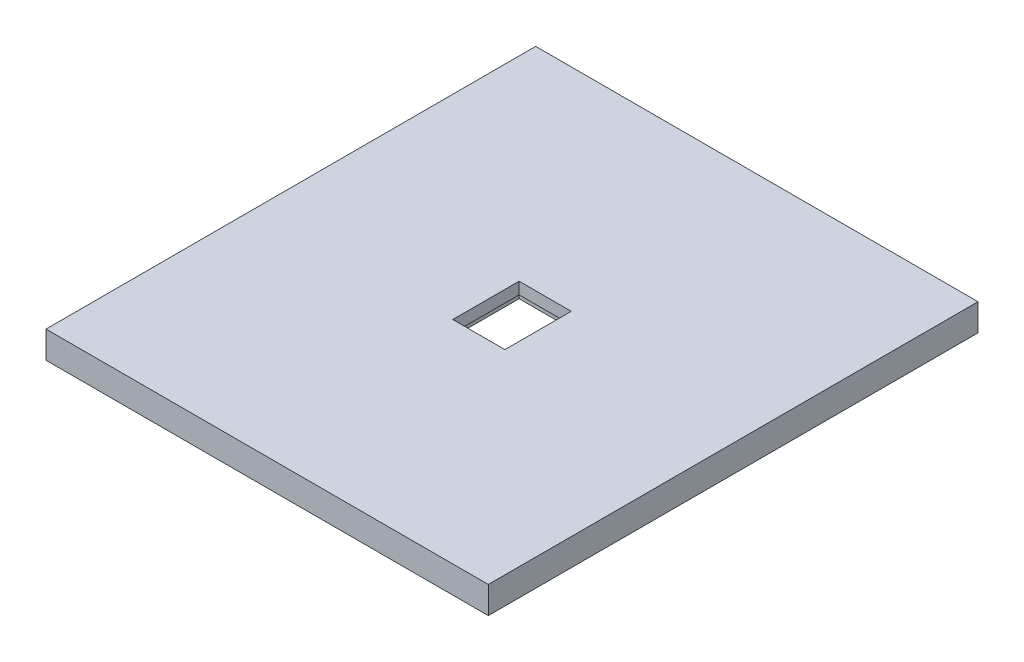
ISO-10303-21;
HEADER;
FILE_DESCRIPTION(('STEP AP214'),'2;1');
FILE_NAME('part.step','',(''),(''),'','','');
FILE_SCHEMA(('AUTOMOTIVE_DESIGN { 1 0 10303 214 1 1 1 1 }'));
ENDSEC;
DATA;
#1=APPLICATION_CONTEXT('core data for automotive mechanical design processes');
#2=APPLICATION_PROTOCOL_DEFINITION('international standard','automotive_design',2000,#1);
#3=PRODUCT_CONTEXT('',#1,'mechanical');
#4=PRODUCT('Part','Part','',(#3));
#5=PRODUCT_RELATED_PRODUCT_CATEGORY('part','',(#4));
#6=PRODUCT_DEFINITION_FORMATION('','',#4);
#7=PRODUCT_DEFINITION_CONTEXT('part definition',#1,'design');
#8=PRODUCT_DEFINITION('design','',#6,#7);
#9=PRODUCT_DEFINITION_SHAPE('','',#8);
#10=(LENGTH_UNIT() NAMED_UNIT(*) SI_UNIT(.MILLI.,.METRE.));
#11=(NAMED_UNIT(*) PLANE_ANGLE_UNIT() SI_UNIT($,.RADIAN.));
#12=(NAMED_UNIT(*) SI_UNIT($,.STERADIAN.) SOLID_ANGLE_UNIT());
#13=UNCERTAINTY_MEASURE_WITH_UNIT(LENGTH_MEASURE(1.E-05),#10,'distance_accuracy_value','');
#14=(GEOMETRIC_REPRESENTATION_CONTEXT(3) GLOBAL_UNCERTAINTY_ASSIGNED_CONTEXT((#13)) GLOBAL_UNIT_ASSIGNED_CONTEXT((#10,
#11,#12)) REPRESENTATION_CONTEXT('',''));
#15=CARTESIAN_POINT('',(0.,0.,0.));
#16=DIRECTION('',(0.,0.,1.));
#17=DIRECTION('',(1.,0.,0.));
#18=AXIS2_PLACEMENT_3D('',#15,#16,#17);
#19=CARTESIAN_POINT('',(0.,-1.92,0.));
#20=DIRECTION('',(0.,1.,0.));
#21=DIRECTION('',(0.,0.,1.));
#22=AXIS2_PLACEMENT_3D('',#19,#20,#21);
#23=PLANE('',#22);
#24=DIRECTION('',(1.,0.,0.));
#25=VECTOR('',#24,1.);
#26=CARTESIAN_POINT('',(0.,-1.92,5.70000000000001));
#27=LINE('',#26,#25);
#28=CARTESIAN_POINT('',(-4.80000000000001,-1.92,5.70000000000001));
#29=VERTEX_POINT('',#28);
#30=CARTESIAN_POINT('',(-1.5,-1.92,5.70000000000001));
#31=VERTEX_POINT('',#30);
#32=EDGE_CURVE('E318',#29,#31,#27,.T.);
#33=ORIENTED_EDGE('',*,*,#32,.T.);
#34=DIRECTION('',(0.,0.,-1.));
#35=VECTOR('',#34,1.);
#36=CARTESIAN_POINT('',(-1.5,-1.92,26.5));
#37=LINE('',#36,#35);
#38=CARTESIAN_POINT('',(-1.5,-1.92,26.5));
#39=VERTEX_POINT('',#38);
#40=EDGE_CURVE('E243',#39,#31,#37,.T.);
#41=ORIENTED_EDGE('',*,*,#40,.F.);
#42=DIRECTION('',(-1.,0.,0.));
#43=VECTOR('',#42,1.);
#44=CARTESIAN_POINT('',(-1.5,-1.92,26.5));
#45=LINE('',#44,#43);
#46=CARTESIAN_POINT('',(1.5,-1.92,26.5));
#47=VERTEX_POINT('',#46);
#48=EDGE_CURVE('E246',#47,#39,#45,.T.);
#49=ORIENTED_EDGE('',*,*,#48,.F.);
#50=DIRECTION('',(0.,0.,1.));
#51=VECTOR('',#50,1.);
#52=CARTESIAN_POINT('',(1.5,-1.92,26.5));
#53=LINE('',#52,#51);
#54=CARTESIAN_POINT('',(1.5,-1.92,5.70000000000001));
#55=VERTEX_POINT('',#54);
#56=EDGE_CURVE('E233',#55,#47,#53,.T.);
#57=ORIENTED_EDGE('',*,*,#56,.F.);
#58=CARTESIAN_POINT('',(4.80000000000001,-1.92,5.70000000000001));
#59=VERTEX_POINT('',#58);
#60=EDGE_CURVE('E317',#55,#59,#27,.T.);
#61=ORIENTED_EDGE('',*,*,#60,.T.);
#62=DIRECTION('',(0.,0.,1.));
#63=VECTOR('',#62,1.);
#64=CARTESIAN_POINT('',(4.80000000000001,-1.92,0.));
#65=LINE('',#64,#63);
#66=CARTESIAN_POINT('',(4.80000000000001,-1.92,-5.70000000000001));
#67=VERTEX_POINT('',#66);
#68=EDGE_CURVE('E314',#67,#59,#65,.T.);
#69=ORIENTED_EDGE('',*,*,#68,.F.);
#70=DIRECTION('',(1.,0.,0.));
#71=VECTOR('',#70,1.);
#72=CARTESIAN_POINT('',(0.,-1.92,-5.70000000000001));
#73=LINE('',#72,#71);
#74=CARTESIAN_POINT('',(-4.80000000000001,-1.92,-5.70000000000001));
#75=VERTEX_POINT('',#74);
#76=EDGE_CURVE('E323',#75,#67,#73,.T.);
#77=ORIENTED_EDGE('',*,*,#76,.F.);
#78=DIRECTION('',(0.,0.,1.));
#79=VECTOR('',#78,1.);
#80=CARTESIAN_POINT('',(-4.80000000000001,-1.92,0.));
#81=LINE('',#80,#79);
#82=EDGE_CURVE('E321',#75,#29,#81,.T.);
#83=ORIENTED_EDGE('',*,*,#82,.T.);
#84=EDGE_LOOP('',(#33,#41,#49,#57,#61,#69,#77,#83));
#85=FACE_BOUND('',#84,.T.);
#86=DIRECTION('',(0.,0.,1.));
#87=VECTOR('',#86,1.);
#88=CARTESIAN_POINT('',(25.,-1.92,0.));
#89=LINE('',#88,#87);
#90=CARTESIAN_POINT('',(25.,-1.92,-28.));
#91=VERTEX_POINT('',#90);
#92=CARTESIAN_POINT('',(25.,-1.92,28.));
#93=VERTEX_POINT('',#92);
#94=EDGE_CURVE('E271',#91,#93,#89,.T.);
#95=ORIENTED_EDGE('',*,*,#94,.T.);
#96=DIRECTION('',(-1.,0.,0.));
#97=VECTOR('',#96,1.);
#98=CARTESIAN_POINT('',(0.,-1.92,28.));
#99=LINE('',#98,#97);
#100=CARTESIAN_POINT('',(-25.,-1.92,28.));
#101=VERTEX_POINT('',#100);
#102=EDGE_CURVE('E255',#93,#101,#99,.T.);
#103=ORIENTED_EDGE('',*,*,#102,.T.);
#104=DIRECTION('',(0.,0.,1.));
#105=VECTOR('',#104,1.);
#106=CARTESIAN_POINT('',(-25.,-1.92,0.));
#107=LINE('',#106,#105);
#108=CARTESIAN_POINT('',(-25.,-1.92,-28.));
#109=VERTEX_POINT('',#108);
#110=EDGE_CURVE('E287',#109,#101,#107,.T.);
#111=ORIENTED_EDGE('',*,*,#110,.F.);
#112=DIRECTION('',(-1.,0.,0.));
#113=VECTOR('',#112,1.);
#114=CARTESIAN_POINT('',(0.,-1.92,-28.));
#115=LINE('',#114,#113);
#116=EDGE_CURVE('E303',#91,#109,#115,.T.);
#117=ORIENTED_EDGE('',*,*,#116,.F.);
#118=EDGE_LOOP('',(#95,#103,#111,#117));
#119=FACE_BOUND('',#118,.T.);
#120=ADVANCED_FACE('F59',(#85,#119),#23,.F.);
#121=DIRECTION('',(0.,0.,-1.));
#122=VECTOR('',#121,1.);
#123=CARTESIAN_POINT('',(-28.,-1.92,0.));
#124=LINE('',#123,#122);
#125=CARTESIAN_POINT('',(-28.,-1.92,31.));
#126=VERTEX_POINT('',#125);
#127=CARTESIAN_POINT('',(-28.,-1.92,-31.));
#128=VERTEX_POINT('',#127);
#129=EDGE_CURVE('E326',#126,#128,#124,.T.);
#130=ORIENTED_EDGE('',*,*,#129,.T.);
#131=DIRECTION('',(1.,0.,0.));
#132=VECTOR('',#131,1.);
#133=CARTESIAN_POINT('',(0.,-1.92,-31.));
#134=LINE('',#133,#132);
#135=CARTESIAN_POINT('',(28.,-1.92,-31.));
#136=VERTEX_POINT('',#135);
#137=EDGE_CURVE('E335',#128,#136,#134,.T.);
#138=ORIENTED_EDGE('',*,*,#137,.T.);
#139=DIRECTION('',(0.,0.,-1.));
#140=VECTOR('',#139,1.);
#141=CARTESIAN_POINT('',(28.,-1.92,0.));
#142=LINE('',#141,#140);
#143=CARTESIAN_POINT('',(28.,-1.92,31.));
#144=VERTEX_POINT('',#143);
#145=EDGE_CURVE('E332',#144,#136,#142,.T.);
#146=ORIENTED_EDGE('',*,*,#145,.F.);
#147=DIRECTION('',(1.,0.,0.));
#148=VECTOR('',#147,1.);
#149=CARTESIAN_POINT('',(0.,-1.92,31.));
#150=LINE('',#149,#148);
#151=EDGE_CURVE('E329',#126,#144,#150,.T.);
#152=ORIENTED_EDGE('',*,*,#151,.F.);
#153=EDGE_LOOP('',(#130,#138,#146,#152));
#154=FACE_BOUND('',#153,.T.);
#155=DIRECTION('',(1.,0.,0.));
#156=VECTOR('',#155,1.);
#157=CARTESIAN_POINT('',(0.,-1.92,29.5));
#158=LINE('',#157,#156);
#159=CARTESIAN_POINT('',(-26.5,-1.92,29.5));
#160=VERTEX_POINT('',#159);
#161=CARTESIAN_POINT('',(26.5,-1.92,29.5));
#162=VERTEX_POINT('',#161);
#163=EDGE_CURVE('E260',#160,#162,#158,.T.);
#164=ORIENTED_EDGE('',*,*,#163,.T.);
#165=DIRECTION('',(0.,0.,-1.));
#166=VECTOR('',#165,1.);
#167=CARTESIAN_POINT('',(26.5,-1.92,0.));
#168=LINE('',#167,#166);
#169=CARTESIAN_POINT('',(26.5,-1.92,-29.5));
#170=VERTEX_POINT('',#169);
#171=EDGE_CURVE('E277',#162,#170,#168,.T.);
#172=ORIENTED_EDGE('',*,*,#171,.T.);
#173=DIRECTION('',(1.,0.,0.));
#174=VECTOR('',#173,1.);
#175=CARTESIAN_POINT('',(0.,-1.92,-29.5));
#176=LINE('',#175,#174);
#177=CARTESIAN_POINT('',(-26.5,-1.92,-29.5));
#178=VERTEX_POINT('',#177);
#179=EDGE_CURVE('E306',#178,#170,#176,.T.);
#180=ORIENTED_EDGE('',*,*,#179,.F.);
#181=DIRECTION('',(0.,0.,-1.));
#182=VECTOR('',#181,1.);
#183=CARTESIAN_POINT('',(-26.5,-1.92,0.));
#184=LINE('',#183,#182);
#185=EDGE_CURVE('E293',#160,#178,#184,.T.);
#186=ORIENTED_EDGE('',*,*,#185,.F.);
#187=EDGE_LOOP('',(#164,#172,#180,#186));
#188=FACE_BOUND('',#187,.T.);
#189=ADVANCED_FACE('F442',(#154,#188),#23,.F.);
#190=CARTESIAN_POINT('',(0.,1.5,0.));
#191=DIRECTION('',(0.,1.,0.));
#192=DIRECTION('',(0.,0.,1.));
#193=AXIS2_PLACEMENT_3D('',#190,#191,#192);
#194=PLANE('',#193);
#195=DIRECTION('',(1.,0.,0.));
#196=VECTOR('',#195,1.);
#197=CARTESIAN_POINT('',(-28.,1.5,31.));
#198=LINE('',#197,#196);
#199=CARTESIAN_POINT('',(-28.,1.5,31.));
#200=VERTEX_POINT('',#199);
#201=CARTESIAN_POINT('',(28.,1.5,31.));
#202=VERTEX_POINT('',#201);
#203=EDGE_CURVE('E389',#200,#202,#198,.T.);
#204=ORIENTED_EDGE('',*,*,#203,.T.);
#205=DIRECTION('',(0.,0.,-1.));
#206=VECTOR('',#205,1.);
#207=CARTESIAN_POINT('',(28.,1.5,31.));
#208=LINE('',#207,#206);
#209=CARTESIAN_POINT('',(28.,1.5,-31.));
#210=VERTEX_POINT('',#209);
#211=EDGE_CURVE('E392',#202,#210,#208,.T.);
#212=ORIENTED_EDGE('',*,*,#211,.T.);
#213=DIRECTION('',(1.,0.,0.));
#214=VECTOR('',#213,1.);
#215=CARTESIAN_POINT('',(-28.,1.5,-31.));
#216=LINE('',#215,#214);
#217=CARTESIAN_POINT('',(-28.,1.5,-31.));
#218=VERTEX_POINT('',#217);
#219=EDGE_CURVE('E394',#218,#210,#216,.T.);
#220=ORIENTED_EDGE('',*,*,#219,.F.);
#221=DIRECTION('',(0.,0.,-1.));
#222=VECTOR('',#221,1.);
#223=CARTESIAN_POINT('',(-28.,1.5,31.));
#224=LINE('',#223,#222);
#225=EDGE_CURVE('E397',#200,#218,#224,.T.);
#226=ORIENTED_EDGE('',*,*,#225,.F.);
#227=EDGE_LOOP('',(#204,#212,#220,#226));
#228=FACE_BOUND('',#227,.T.);
#229=DIRECTION('',(0.,0.,-1.));
#230=VECTOR('',#229,1.);
#231=CARTESIAN_POINT('',(3.3,1.5,4.2));
#232=LINE('',#231,#230);
#233=CARTESIAN_POINT('',(3.3,1.5,4.2));
#234=VERTEX_POINT('',#233);
#235=CARTESIAN_POINT('',(3.3,1.5,-4.2));
#236=VERTEX_POINT('',#235);
#237=EDGE_CURVE('E360',#234,#236,#232,.T.);
#238=ORIENTED_EDGE('',*,*,#237,.F.);
#239=DIRECTION('',(1.,0.,0.));
#240=VECTOR('',#239,1.);
#241=CARTESIAN_POINT('',(-3.3,1.5,4.2));
#242=LINE('',#241,#240);
#243=CARTESIAN_POINT('',(-3.3,1.5,4.2));
#244=VERTEX_POINT('',#243);
#245=EDGE_CURVE('E358',#244,#234,#242,.T.);
#246=ORIENTED_EDGE('',*,*,#245,.F.);
#247=DIRECTION('',(0.,0.,-1.));
#248=VECTOR('',#247,1.);
#249=CARTESIAN_POINT('',(-3.3,1.5,4.2));
#250=LINE('',#249,#248);
#251=CARTESIAN_POINT('',(-3.3,1.5,-4.2));
#252=VERTEX_POINT('',#251);
#253=EDGE_CURVE('E366',#244,#252,#250,.T.);
#254=ORIENTED_EDGE('',*,*,#253,.T.);
#255=DIRECTION('',(1.,0.,0.));
#256=VECTOR('',#255,1.);
#257=CARTESIAN_POINT('',(-3.3,1.5,-4.2));
#258=LINE('',#257,#256);
#259=EDGE_CURVE('E363',#252,#236,#258,.T.);
#260=ORIENTED_EDGE('',*,*,#259,.T.);
#261=EDGE_LOOP('',(#238,#246,#254,#260));
#262=FACE_BOUND('',#261,.T.);
#263=ADVANCED_FACE('F446',(#228,#262),#194,.T.);
#264=CARTESIAN_POINT('',(0.,0.,0.));
#265=DIRECTION('',(0.,1.,0.));
#266=DIRECTION('',(0.,0.,1.));
#267=AXIS2_PLACEMENT_3D('',#264,#265,#266);
#268=PLANE('',#267);
#269=DIRECTION('',(1.,0.,0.));
#270=VECTOR('',#269,1.);
#271=CARTESIAN_POINT('',(0.,0.,-5.70000000000001));
#272=LINE('',#271,#270);
#273=CARTESIAN_POINT('',(-4.80000000000001,0.,-5.70000000000001));
#274=VERTEX_POINT('',#273);
#275=CARTESIAN_POINT('',(4.80000000000001,0.,-5.70000000000001));
#276=VERTEX_POINT('',#275);
#277=EDGE_CURVE('E82',#274,#276,#272,.T.);
#278=ORIENTED_EDGE('',*,*,#277,.T.);
#279=DIRECTION('',(0.,0.,1.));
#280=VECTOR('',#279,1.);
#281=CARTESIAN_POINT('',(4.80000000000001,0.,0.));
#282=LINE('',#281,#280);
#283=CARTESIAN_POINT('',(4.80000000000001,0.,5.70000000000001));
#284=VERTEX_POINT('',#283);
#285=EDGE_CURVE('E313',#276,#284,#282,.T.);
#286=ORIENTED_EDGE('',*,*,#285,.T.);
#287=DIRECTION('',(1.,0.,0.));
#288=VECTOR('',#287,1.);
#289=CARTESIAN_POINT('',(0.,0.,5.70000000000001));
#290=LINE('',#289,#288);
#291=CARTESIAN_POINT('',(-4.80000000000001,0.,5.70000000000001));
#292=VERTEX_POINT('',#291);
#293=EDGE_CURVE('E340',#292,#284,#290,.T.);
#294=ORIENTED_EDGE('',*,*,#293,.F.);
#295=DIRECTION('',(0.,0.,1.));
#296=VECTOR('',#295,1.);
#297=CARTESIAN_POINT('',(-4.80000000000001,0.,0.));
#298=LINE('',#297,#296);
#299=EDGE_CURVE('E343',#274,#292,#298,.T.);
#300=ORIENTED_EDGE('',*,*,#299,.F.);
#301=EDGE_LOOP('',(#278,#286,#294,#300));
#302=FACE_BOUND('',#301,.T.);
#303=DIRECTION('',(1.,0.,0.));
#304=VECTOR('',#303,1.);
#305=CARTESIAN_POINT('',(-3.3,0.,4.2));
#306=LINE('',#305,#304);
#307=CARTESIAN_POINT('',(-3.3,0.,4.2));
#308=VERTEX_POINT('',#307);
#309=CARTESIAN_POINT('',(3.3,0.,4.2));
#310=VERTEX_POINT('',#309);
#311=EDGE_CURVE('E349',#308,#310,#306,.T.);
#312=ORIENTED_EDGE('',*,*,#311,.T.);
#313=DIRECTION('',(0.,0.,-1.));
#314=VECTOR('',#313,1.);
#315=CARTESIAN_POINT('',(3.3,0.,4.2));
#316=LINE('',#315,#314);
#317=CARTESIAN_POINT('',(3.3,0.,-4.2));
#318=VERTEX_POINT('',#317);
#319=EDGE_CURVE('E372',#310,#318,#316,.T.);
#320=ORIENTED_EDGE('',*,*,#319,.T.);
#321=DIRECTION('',(1.,0.,0.));
#322=VECTOR('',#321,1.);
#323=CARTESIAN_POINT('',(-3.3,0.,-4.2));
#324=LINE('',#323,#322);
#325=CARTESIAN_POINT('',(-3.3,0.,-4.2));
#326=VERTEX_POINT('',#325);
#327=EDGE_CURVE('E375',#326,#318,#324,.T.);
#328=ORIENTED_EDGE('',*,*,#327,.F.);
#329=DIRECTION('',(0.,0.,-1.));
#330=VECTOR('',#329,1.);
#331=CARTESIAN_POINT('',(-3.3,0.,4.2));
#332=LINE('',#331,#330);
#333=EDGE_CURVE('E361',#308,#326,#332,.T.);
#334=ORIENTED_EDGE('',*,*,#333,.F.);
#335=EDGE_LOOP('',(#312,#320,#328,#334));
#336=FACE_BOUND('',#335,.T.);
#337=ADVANCED_FACE('F424',(#302,#336),#268,.F.);
#338=CARTESIAN_POINT('',(-28.,1.5,31.));
#339=DIRECTION('',(0.,0.,-1.));
#340=DIRECTION('',(-1.,0.,0.));
#341=AXIS2_PLACEMENT_3D('',#338,#339,#340);
#342=PLANE('',#341);
#343=DIRECTION('',(0.,-1.,0.));
#344=VECTOR('',#343,1.);
#345=CARTESIAN_POINT('',(-28.,1.5,31.));
#346=LINE('',#345,#344);
#347=EDGE_CURVE('E400',#200,#126,#346,.T.);
#348=ORIENTED_EDGE('',*,*,#347,.T.);
#349=ORIENTED_EDGE('',*,*,#151,.T.);
#350=DIRECTION('',(0.,-1.,0.));
#351=VECTOR('',#350,1.);
#352=CARTESIAN_POINT('',(28.,1.5,31.));
#353=LINE('',#352,#351);
#354=EDGE_CURVE('E406',#202,#144,#353,.T.);
#355=ORIENTED_EDGE('',*,*,#354,.F.);
#356=ORIENTED_EDGE('',*,*,#203,.F.);
#357=EDGE_LOOP('',(#348,#349,#355,#356));
#358=FACE_BOUND('',#357,.T.);
#359=ADVANCED_FACE('F61',(#358),#342,.F.);
#360=CARTESIAN_POINT('',(28.,1.5,31.));
#361=DIRECTION('',(-1.,0.,0.));
#362=DIRECTION('',(0.,0.,1.));
#363=AXIS2_PLACEMENT_3D('',#360,#361,#362);
#364=PLANE('',#363);
#365=ORIENTED_EDGE('',*,*,#354,.T.);
#366=ORIENTED_EDGE('',*,*,#145,.T.);
#367=DIRECTION('',(0.,-1.,0.));
#368=VECTOR('',#367,1.);
#369=CARTESIAN_POINT('',(28.,1.5,-31.));
#370=LINE('',#369,#368);
#371=EDGE_CURVE('E404',#210,#136,#370,.T.);
#372=ORIENTED_EDGE('',*,*,#371,.F.);
#373=ORIENTED_EDGE('',*,*,#211,.F.);
#374=EDGE_LOOP('',(#365,#366,#372,#373));
#375=FACE_BOUND('',#374,.T.);
#376=ADVANCED_FACE('F637',(#375),#364,.F.);
#377=CARTESIAN_POINT('',(-28.,1.5,-31.));
#378=DIRECTION('',(0.,0.,-1.));
#379=DIRECTION('',(-1.,0.,0.));
#380=AXIS2_PLACEMENT_3D('',#377,#378,#379);
#381=PLANE('',#380);
#382=ORIENTED_EDGE('',*,*,#371,.T.);
#383=ORIENTED_EDGE('',*,*,#137,.F.);
#384=DIRECTION('',(0.,-1.,0.));
#385=VECTOR('',#384,1.);
#386=CARTESIAN_POINT('',(-28.,1.5,-31.));
#387=LINE('',#386,#385);
#388=EDGE_CURVE('E402',#218,#128,#387,.T.);
#389=ORIENTED_EDGE('',*,*,#388,.F.);
#390=ORIENTED_EDGE('',*,*,#219,.T.);
#391=EDGE_LOOP('',(#382,#383,#389,#390));
#392=FACE_BOUND('',#391,.T.);
#393=ADVANCED_FACE('F644',(#392),#381,.T.);
#394=CARTESIAN_POINT('',(-28.,1.5,31.));
#395=DIRECTION('',(-1.,0.,0.));
#396=DIRECTION('',(0.,0.,1.));
#397=AXIS2_PLACEMENT_3D('',#394,#395,#396);
#398=PLANE('',#397);
#399=ORIENTED_EDGE('',*,*,#388,.T.);
#400=ORIENTED_EDGE('',*,*,#129,.F.);
#401=ORIENTED_EDGE('',*,*,#347,.F.);
#402=ORIENTED_EDGE('',*,*,#225,.T.);
#403=EDGE_LOOP('',(#399,#400,#401,#402));
#404=FACE_BOUND('',#403,.T.);
#405=ADVANCED_FACE('F651',(#404),#398,.T.);
#406=CARTESIAN_POINT('',(-3.3,1.5,4.2));
#407=DIRECTION('',(0.,0.,-1.));
#408=DIRECTION('',(-1.,0.,0.));
#409=AXIS2_PLACEMENT_3D('',#406,#407,#408);
#410=PLANE('',#409);
#411=ORIENTED_EDGE('',*,*,#311,.F.);
#412=DIRECTION('',(0.,-1.,0.));
#413=VECTOR('',#412,1.);
#414=CARTESIAN_POINT('',(-3.3,1.5,4.2));
#415=LINE('',#414,#413);
#416=EDGE_CURVE('E369',#244,#308,#415,.T.);
#417=ORIENTED_EDGE('',*,*,#416,.F.);
#418=ORIENTED_EDGE('',*,*,#245,.T.);
#419=DIRECTION('',(0.,-1.,0.));
#420=VECTOR('',#419,1.);
#421=CARTESIAN_POINT('',(3.3,1.5,4.2));
#422=LINE('',#421,#420);
#423=EDGE_CURVE('E386',#234,#310,#422,.T.);
#424=ORIENTED_EDGE('',*,*,#423,.T.);
#425=EDGE_LOOP('',(#411,#417,#418,#424));
#426=FACE_BOUND('',#425,.T.);
#427=ADVANCED_FACE('F659',(#426),#410,.T.);
#428=CARTESIAN_POINT('',(3.3,1.5,4.2));
#429=DIRECTION('',(-1.,0.,0.));
#430=DIRECTION('',(0.,0.,1.));
#431=AXIS2_PLACEMENT_3D('',#428,#429,#430);
#432=PLANE('',#431);
#433=ORIENTED_EDGE('',*,*,#319,.F.);
#434=ORIENTED_EDGE('',*,*,#423,.F.);
#435=ORIENTED_EDGE('',*,*,#237,.T.);
#436=DIRECTION('',(0.,-1.,0.));
#437=VECTOR('',#436,1.);
#438=CARTESIAN_POINT('',(3.3,1.5,-4.2));
#439=LINE('',#438,#437);
#440=EDGE_CURVE('E384',#236,#318,#439,.T.);
#441=ORIENTED_EDGE('',*,*,#440,.T.);
#442=EDGE_LOOP('',(#433,#434,#435,#441));
#443=FACE_BOUND('',#442,.T.);
#444=ADVANCED_FACE('F667',(#443),#432,.T.);
#445=CARTESIAN_POINT('',(-3.3,1.5,-4.2));
#446=DIRECTION('',(0.,0.,-1.));
#447=DIRECTION('',(-1.,0.,0.));
#448=AXIS2_PLACEMENT_3D('',#445,#446,#447);
#449=PLANE('',#448);
#450=ORIENTED_EDGE('',*,*,#327,.T.);
#451=ORIENTED_EDGE('',*,*,#440,.F.);
#452=ORIENTED_EDGE('',*,*,#259,.F.);
#453=DIRECTION('',(0.,-1.,0.));
#454=VECTOR('',#453,1.);
#455=CARTESIAN_POINT('',(-3.3,1.5,-4.2));
#456=LINE('',#455,#454);
#457=EDGE_CURVE('E382',#252,#326,#456,.T.);
#458=ORIENTED_EDGE('',*,*,#457,.T.);
#459=EDGE_LOOP('',(#450,#451,#452,#458));
#460=FACE_BOUND('',#459,.T.);
#461=ADVANCED_FACE('F675',(#460),#449,.F.);
#462=CARTESIAN_POINT('',(-3.3,1.5,4.2));
#463=DIRECTION('',(-1.,0.,0.));
#464=DIRECTION('',(0.,0.,1.));
#465=AXIS2_PLACEMENT_3D('',#462,#463,#464);
#466=PLANE('',#465);
#467=ORIENTED_EDGE('',*,*,#333,.T.);
#468=ORIENTED_EDGE('',*,*,#457,.F.);
#469=ORIENTED_EDGE('',*,*,#253,.F.);
#470=ORIENTED_EDGE('',*,*,#416,.T.);
#471=EDGE_LOOP('',(#467,#468,#469,#470));
#472=FACE_BOUND('',#471,.T.);
#473=ADVANCED_FACE('F438',(#472),#466,.F.);
#474=CARTESIAN_POINT('',(4.80000000000001,-1.92,0.));
#475=DIRECTION('',(-1.,0.,0.));
#476=DIRECTION('',(0.,0.,1.));
#477=AXIS2_PLACEMENT_3D('',#474,#475,#476);
#478=PLANE('',#477);
#479=ORIENTED_EDGE('',*,*,#285,.F.);
#480=DIRECTION('',(0.,1.,0.));
#481=VECTOR('',#480,1.);
#482=CARTESIAN_POINT('',(4.80000000000001,-1.92,-5.70000000000001));
#483=LINE('',#482,#481);
#484=EDGE_CURVE('E347',#67,#276,#483,.T.);
#485=ORIENTED_EDGE('',*,*,#484,.F.);
#486=ORIENTED_EDGE('',*,*,#68,.T.);
#487=DIRECTION('',(0.,1.,0.));
#488=VECTOR('',#487,1.);
#489=CARTESIAN_POINT('',(4.80000000000001,-1.92,5.70000000000001));
#490=LINE('',#489,#488);
#491=EDGE_CURVE('E338',#59,#284,#490,.T.);
#492=ORIENTED_EDGE('',*,*,#491,.T.);
#493=EDGE_LOOP('',(#479,#485,#486,#492));
#494=FACE_BOUND('',#493,.T.);
#495=ADVANCED_FACE('F428',(#494),#478,.T.);
#496=CARTESIAN_POINT('',(0.,-1.92,-5.70000000000001));
#497=DIRECTION('',(0.,0.,1.));
#498=DIRECTION('',(1.,0.,0.));
#499=AXIS2_PLACEMENT_3D('',#496,#497,#498);
#500=PLANE('',#499);
#501=ORIENTED_EDGE('',*,*,#277,.F.);
#502=DIRECTION('',(0.,1.,0.));
#503=VECTOR('',#502,1.);
#504=CARTESIAN_POINT('',(-4.80000000000001,-1.92,-5.70000000000001));
#505=LINE('',#504,#503);
#506=EDGE_CURVE('E350',#75,#274,#505,.T.);
#507=ORIENTED_EDGE('',*,*,#506,.F.);
#508=ORIENTED_EDGE('',*,*,#76,.T.);
#509=ORIENTED_EDGE('',*,*,#484,.T.);
#510=EDGE_LOOP('',(#501,#507,#508,#509));
#511=FACE_BOUND('',#510,.T.);
#512=ADVANCED_FACE('F430',(#511),#500,.T.);
#513=CARTESIAN_POINT('',(-4.80000000000001,-1.92,0.));
#514=DIRECTION('',(-1.,0.,0.));
#515=DIRECTION('',(0.,0.,1.));
#516=AXIS2_PLACEMENT_3D('',#513,#514,#515);
#517=PLANE('',#516);
#518=ORIENTED_EDGE('',*,*,#299,.T.);
#519=DIRECTION('',(0.,1.,0.));
#520=VECTOR('',#519,1.);
#521=CARTESIAN_POINT('',(-4.80000000000001,-1.92,5.70000000000001));
#522=LINE('',#521,#520);
#523=EDGE_CURVE('E353',#29,#292,#522,.T.);
#524=ORIENTED_EDGE('',*,*,#523,.F.);
#525=ORIENTED_EDGE('',*,*,#82,.F.);
#526=ORIENTED_EDGE('',*,*,#506,.T.);
#527=EDGE_LOOP('',(#518,#524,#525,#526));
#528=FACE_BOUND('',#527,.T.);
#529=ADVANCED_FACE('F422',(#528),#517,.F.);
#530=CARTESIAN_POINT('',(0.,-1.92,5.70000000000001));
#531=DIRECTION('',(0.,0.,1.));
#532=DIRECTION('',(1.,0.,0.));
#533=AXIS2_PLACEMENT_3D('',#530,#531,#532);
#534=PLANE('',#533);
#535=DIRECTION('',(1.,0.,0.));
#536=VECTOR('',#535,1.);
#537=CARTESIAN_POINT('',(0.,-1.62,5.70000000000001));
#538=LINE('',#537,#536);
#539=CARTESIAN_POINT('',(-1.5,-1.62,5.70000000000001));
#540=VERTEX_POINT('',#539);
#541=CARTESIAN_POINT('',(1.5,-1.62,5.70000000000001));
#542=VERTEX_POINT('',#541);
#543=EDGE_CURVE('E225',#540,#542,#538,.T.);
#544=ORIENTED_EDGE('',*,*,#543,.F.);
#545=DIRECTION('',(0.,-1.,0.));
#546=VECTOR('',#545,1.);
#547=CARTESIAN_POINT('',(-1.5,-1.92,5.70000000000001));
#548=LINE('',#547,#546);
#549=EDGE_CURVE('E12',#540,#31,#548,.T.);
#550=ORIENTED_EDGE('',*,*,#549,.T.);
#551=ORIENTED_EDGE('',*,*,#32,.F.);
#552=ORIENTED_EDGE('',*,*,#523,.T.);
#553=ORIENTED_EDGE('',*,*,#293,.T.);
#554=ORIENTED_EDGE('',*,*,#491,.F.);
#555=ORIENTED_EDGE('',*,*,#60,.F.);
#556=DIRECTION('',(0.,1.,0.));
#557=VECTOR('',#556,1.);
#558=CARTESIAN_POINT('',(1.5,-1.92,5.70000000000001));
#559=LINE('',#558,#557);
#560=EDGE_CURVE('E67',#55,#542,#559,.T.);
#561=ORIENTED_EDGE('',*,*,#560,.T.);
#562=EDGE_LOOP('',(#544,#550,#551,#552,#553,#554,#555,#561));
#563=FACE_BOUND('',#562,.T.);
#564=ADVANCED_FACE('F410',(#563),#534,.F.);
#565=CARTESIAN_POINT('',(-25.,-0.42,0.));
#566=DIRECTION('',(1.,0.,0.));
#567=DIRECTION('',(0.,0.,-1.));
#568=AXIS2_PLACEMENT_3D('',#565,#566,#567);
#569=PLANE('',#568);
#570=ORIENTED_EDGE('',*,*,#110,.T.);
#571=DIRECTION('',(0.,-1.,0.));
#572=VECTOR('',#571,1.);
#573=CARTESIAN_POINT('',(-25.,-0.42,28.));
#574=LINE('',#573,#572);
#575=CARTESIAN_POINT('',(-25.,-0.42,28.));
#576=VERTEX_POINT('',#575);
#577=EDGE_CURVE('E263',#576,#101,#574,.T.);
#578=ORIENTED_EDGE('',*,*,#577,.F.);
#579=DIRECTION('',(0.,0.,1.));
#580=VECTOR('',#579,1.);
#581=CARTESIAN_POINT('',(-25.,-0.42,0.));
#582=LINE('',#581,#580);
#583=CARTESIAN_POINT('',(-25.,-0.42,-28.));
#584=VERTEX_POINT('',#583);
#585=EDGE_CURVE('E290',#584,#576,#582,.T.);
#586=ORIENTED_EDGE('',*,*,#585,.F.);
#587=DIRECTION('',(0.,-1.,0.));
#588=VECTOR('',#587,1.);
#589=CARTESIAN_POINT('',(-25.,-0.42,-28.));
#590=LINE('',#589,#588);
#591=EDGE_CURVE('E311',#584,#109,#590,.T.);
#592=ORIENTED_EDGE('',*,*,#591,.T.);
#593=EDGE_LOOP('',(#570,#578,#586,#592));
#594=FACE_BOUND('',#593,.T.);
#595=ADVANCED_FACE('F449',(#594),#569,.F.);
#596=CARTESIAN_POINT('',(0.,-0.42,-28.));
#597=DIRECTION('',(0.,0.,1.));
#598=DIRECTION('',(1.,0.,0.));
#599=AXIS2_PLACEMENT_3D('',#596,#597,#598);
#600=PLANE('',#599);
#601=ORIENTED_EDGE('',*,*,#116,.T.);
#602=ORIENTED_EDGE('',*,*,#591,.F.);
#603=DIRECTION('',(-1.,0.,0.));
#604=VECTOR('',#603,1.);
#605=CARTESIAN_POINT('',(0.,-0.42,-28.));
#606=LINE('',#605,#604);
#607=CARTESIAN_POINT('',(25.,-0.42,-28.));
#608=VERTEX_POINT('',#607);
#609=EDGE_CURVE('E292',#608,#584,#606,.T.);
#610=ORIENTED_EDGE('',*,*,#609,.F.);
#611=DIRECTION('',(0.,-1.,0.));
#612=VECTOR('',#611,1.);
#613=CARTESIAN_POINT('',(25.,-0.42,-28.));
#614=LINE('',#613,#612);
#615=EDGE_CURVE('E280',#608,#91,#614,.T.);
#616=ORIENTED_EDGE('',*,*,#615,.T.);
#617=EDGE_LOOP('',(#601,#602,#610,#616));
#618=FACE_BOUND('',#617,.T.);
#619=ADVANCED_FACE('F452',(#618),#600,.F.);
#620=CARTESIAN_POINT('',(0.,-0.42,-29.5));
#621=DIRECTION('',(0.,0.,-1.));
#622=DIRECTION('',(-1.,0.,0.));
#623=AXIS2_PLACEMENT_3D('',#620,#621,#622);
#624=PLANE('',#623);
#625=ORIENTED_EDGE('',*,*,#179,.T.);
#626=DIRECTION('',(0.,-1.,0.));
#627=VECTOR('',#626,1.);
#628=CARTESIAN_POINT('',(26.5,-0.42,-29.5));
#629=LINE('',#628,#627);
#630=CARTESIAN_POINT('',(26.5,-0.42,-29.5));
#631=VERTEX_POINT('',#630);
#632=EDGE_CURVE('E284',#631,#170,#629,.T.);
#633=ORIENTED_EDGE('',*,*,#632,.F.);
#634=DIRECTION('',(1.,0.,0.));
#635=VECTOR('',#634,1.);
#636=CARTESIAN_POINT('',(0.,-0.42,-29.5));
#637=LINE('',#636,#635);
#638=CARTESIAN_POINT('',(-26.5,-0.42,-29.5));
#639=VERTEX_POINT('',#638);
#640=EDGE_CURVE('E296',#639,#631,#637,.T.);
#641=ORIENTED_EDGE('',*,*,#640,.F.);
#642=DIRECTION('',(0.,-1.,0.));
#643=VECTOR('',#642,1.);
#644=CARTESIAN_POINT('',(-26.5,-0.42,-29.5));
#645=LINE('',#644,#643);
#646=EDGE_CURVE('E301',#639,#178,#645,.T.);
#647=ORIENTED_EDGE('',*,*,#646,.T.);
#648=EDGE_LOOP('',(#625,#633,#641,#647));
#649=FACE_BOUND('',#648,.T.);
#650=ADVANCED_FACE('F456',(#649),#624,.F.);
#651=CARTESIAN_POINT('',(-26.5,-0.42,0.));
#652=DIRECTION('',(-1.,0.,0.));
#653=DIRECTION('',(0.,0.,1.));
#654=AXIS2_PLACEMENT_3D('',#651,#652,#653);
#655=PLANE('',#654);
#656=ORIENTED_EDGE('',*,*,#185,.T.);
#657=ORIENTED_EDGE('',*,*,#646,.F.);
#658=DIRECTION('',(0.,0.,-1.));
#659=VECTOR('',#658,1.);
#660=CARTESIAN_POINT('',(-26.5,-0.42,0.));
#661=LINE('',#660,#659);
#662=CARTESIAN_POINT('',(-26.5,-0.42,29.5));
#663=VERTEX_POINT('',#662);
#664=EDGE_CURVE('E298',#663,#639,#661,.T.);
#665=ORIENTED_EDGE('',*,*,#664,.F.);
#666=DIRECTION('',(0.,-1.,0.));
#667=VECTOR('',#666,1.);
#668=CARTESIAN_POINT('',(-26.5,-0.42,29.5));
#669=LINE('',#668,#667);
#670=EDGE_CURVE('E268',#663,#160,#669,.T.);
#671=ORIENTED_EDGE('',*,*,#670,.T.);
#672=EDGE_LOOP('',(#656,#657,#665,#671));
#673=FACE_BOUND('',#672,.T.);
#674=ADVANCED_FACE('F460',(#673),#655,.F.);
#675=CARTESIAN_POINT('',(0.,-0.42,0.));
#676=DIRECTION('',(0.,-1.,0.));
#677=DIRECTION('',(0.,0.,-1.));
#678=AXIS2_PLACEMENT_3D('',#675,#676,#677);
#679=PLANE('',#678);
#680=DIRECTION('',(-1.,0.,0.));
#681=VECTOR('',#680,1.);
#682=CARTESIAN_POINT('',(0.,-0.42,28.));
#683=LINE('',#682,#681);
#684=CARTESIAN_POINT('',(25.,-0.42,28.));
#685=VERTEX_POINT('',#684);
#686=EDGE_CURVE('E256',#685,#576,#683,.T.);
#687=ORIENTED_EDGE('',*,*,#686,.F.);
#688=DIRECTION('',(0.,0.,1.));
#689=VECTOR('',#688,1.);
#690=CARTESIAN_POINT('',(25.,-0.42,0.));
#691=LINE('',#690,#689);
#692=EDGE_CURVE('E274',#608,#685,#691,.T.);
#693=ORIENTED_EDGE('',*,*,#692,.F.);
#694=ORIENTED_EDGE('',*,*,#609,.T.);
#695=ORIENTED_EDGE('',*,*,#585,.T.);
#696=EDGE_LOOP('',(#687,#693,#694,#695));
#697=FACE_BOUND('',#696,.T.);
#698=DIRECTION('',(0.,0.,-1.));
#699=VECTOR('',#698,1.);
#700=CARTESIAN_POINT('',(26.5,-0.42,0.));
#701=LINE('',#700,#699);
#702=CARTESIAN_POINT('',(26.5,-0.42,29.5));
#703=VERTEX_POINT('',#702);
#704=EDGE_CURVE('E276',#703,#631,#701,.T.);
#705=ORIENTED_EDGE('',*,*,#704,.F.);
#706=DIRECTION('',(1.,0.,0.));
#707=VECTOR('',#706,1.);
#708=CARTESIAN_POINT('',(0.,-0.42,29.5));
#709=LINE('',#708,#707);
#710=EDGE_CURVE('E259',#663,#703,#709,.T.);
#711=ORIENTED_EDGE('',*,*,#710,.F.);
#712=ORIENTED_EDGE('',*,*,#664,.T.);
#713=ORIENTED_EDGE('',*,*,#640,.T.);
#714=EDGE_LOOP('',(#705,#711,#712,#713));
#715=FACE_BOUND('',#714,.T.);
#716=ADVANCED_FACE('F464',(#697,#715),#679,.T.);
#717=CARTESIAN_POINT('',(26.5,-0.42,0.));
#718=DIRECTION('',(-1.,0.,0.));
#719=DIRECTION('',(0.,0.,1.));
#720=AXIS2_PLACEMENT_3D('',#717,#718,#719);
#721=PLANE('',#720);
#722=ORIENTED_EDGE('',*,*,#171,.F.);
#723=DIRECTION('',(0.,-1.,0.));
#724=VECTOR('',#723,1.);
#725=CARTESIAN_POINT('',(26.5,-0.42,29.5));
#726=LINE('',#725,#724);
#727=EDGE_CURVE('E248',#703,#162,#726,.T.);
#728=ORIENTED_EDGE('',*,*,#727,.F.);
#729=ORIENTED_EDGE('',*,*,#704,.T.);
#730=ORIENTED_EDGE('',*,*,#632,.T.);
#731=EDGE_LOOP('',(#722,#728,#729,#730));
#732=FACE_BOUND('',#731,.T.);
#733=ADVANCED_FACE('F468',(#732),#721,.T.);
#734=CARTESIAN_POINT('',(25.,-0.42,0.));
#735=DIRECTION('',(1.,0.,0.));
#736=DIRECTION('',(0.,0.,-1.));
#737=AXIS2_PLACEMENT_3D('',#734,#735,#736);
#738=PLANE('',#737);
#739=ORIENTED_EDGE('',*,*,#94,.F.);
#740=ORIENTED_EDGE('',*,*,#615,.F.);
#741=ORIENTED_EDGE('',*,*,#692,.T.);
#742=DIRECTION('',(0.,-1.,0.));
#743=VECTOR('',#742,1.);
#744=CARTESIAN_POINT('',(25.,-0.42,28.));
#745=LINE('',#744,#743);
#746=EDGE_CURVE('E252',#685,#93,#745,.T.);
#747=ORIENTED_EDGE('',*,*,#746,.T.);
#748=EDGE_LOOP('',(#739,#740,#741,#747));
#749=FACE_BOUND('',#748,.T.);
#750=ADVANCED_FACE('F470',(#749),#738,.T.);
#751=CARTESIAN_POINT('',(0.,-0.42,29.5));
#752=DIRECTION('',(0.,0.,-1.));
#753=DIRECTION('',(-1.,0.,0.));
#754=AXIS2_PLACEMENT_3D('',#751,#752,#753);
#755=PLANE('',#754);
#756=ORIENTED_EDGE('',*,*,#163,.F.);
#757=ORIENTED_EDGE('',*,*,#670,.F.);
#758=ORIENTED_EDGE('',*,*,#710,.T.);
#759=ORIENTED_EDGE('',*,*,#727,.T.);
#760=EDGE_LOOP('',(#756,#757,#758,#759));
#761=FACE_BOUND('',#760,.T.);
#762=ADVANCED_FACE('F473',(#761),#755,.T.);
#763=CARTESIAN_POINT('',(0.,-0.42,28.));
#764=DIRECTION('',(0.,0.,1.));
#765=DIRECTION('',(1.,0.,0.));
#766=AXIS2_PLACEMENT_3D('',#763,#764,#765);
#767=PLANE('',#766);
#768=ORIENTED_EDGE('',*,*,#102,.F.);
#769=ORIENTED_EDGE('',*,*,#746,.F.);
#770=ORIENTED_EDGE('',*,*,#686,.T.);
#771=ORIENTED_EDGE('',*,*,#577,.T.);
#772=EDGE_LOOP('',(#768,#769,#770,#771));
#773=FACE_BOUND('',#772,.T.);
#774=ADVANCED_FACE('F478',(#773),#767,.T.);
#775=CARTESIAN_POINT('',(-1.5,-1.62,26.5));
#776=DIRECTION('',(-1.,0.,0.));
#777=DIRECTION('',(0.,0.,1.));
#778=AXIS2_PLACEMENT_3D('',#775,#776,#777);
#779=PLANE('',#778);
#780=DIRECTION('',(0.,0.,-1.));
#781=VECTOR('',#780,1.);
#782=CARTESIAN_POINT('',(-1.5,-1.62,26.5));
#783=LINE('',#782,#781);
#784=CARTESIAN_POINT('',(-1.5,-1.62,26.5));
#785=VERTEX_POINT('',#784);
#786=EDGE_CURVE('E74',#785,#540,#783,.T.);
#787=ORIENTED_EDGE('',*,*,#786,.F.);
#788=DIRECTION('',(0.,-1.,0.));
#789=VECTOR('',#788,1.);
#790=CARTESIAN_POINT('',(-1.5,-1.62,26.5));
#791=LINE('',#790,#789);
#792=EDGE_CURVE('E237',#785,#39,#791,.T.);
#793=ORIENTED_EDGE('',*,*,#792,.T.);
#794=ORIENTED_EDGE('',*,*,#40,.T.);
#795=ORIENTED_EDGE('',*,*,#549,.F.);
#796=EDGE_LOOP('',(#787,#793,#794,#795));
#797=FACE_BOUND('',#796,.T.);
#798=ADVANCED_FACE('F418',(#797),#779,.F.);
#799=CARTESIAN_POINT('',(1.5,-1.62,26.5));
#800=DIRECTION('',(1.,0.,0.));
#801=DIRECTION('',(0.,0.,-1.));
#802=AXIS2_PLACEMENT_3D('',#799,#800,#801);
#803=PLANE('',#802);
#804=ORIENTED_EDGE('',*,*,#56,.T.);
#805=DIRECTION('',(0.,-1.,0.));
#806=VECTOR('',#805,1.);
#807=CARTESIAN_POINT('',(1.5,-1.62,26.5));
#808=LINE('',#807,#806);
#809=CARTESIAN_POINT('',(1.5,-1.62,26.5));
#810=VERTEX_POINT('',#809);
#811=EDGE_CURVE('E230',#810,#47,#808,.T.);
#812=ORIENTED_EDGE('',*,*,#811,.F.);
#813=DIRECTION('',(0.,0.,1.));
#814=VECTOR('',#813,1.);
#815=CARTESIAN_POINT('',(1.5,-1.62,26.5));
#816=LINE('',#815,#814);
#817=EDGE_CURVE('E219',#542,#810,#816,.T.);
#818=ORIENTED_EDGE('',*,*,#817,.F.);
#819=ORIENTED_EDGE('',*,*,#560,.F.);
#820=EDGE_LOOP('',(#804,#812,#818,#819));
#821=FACE_BOUND('',#820,.T.);
#822=ADVANCED_FACE('F231',(#821),#803,.F.);
#823=CARTESIAN_POINT('',(0.,-1.62,0.));
#824=DIRECTION('',(0.,-1.,0.));
#825=DIRECTION('',(0.,0.,-1.));
#826=AXIS2_PLACEMENT_3D('',#823,#824,#825);
#827=PLANE('',#826);
#828=ORIENTED_EDGE('',*,*,#543,.T.);
#829=ORIENTED_EDGE('',*,*,#817,.T.);
#830=DIRECTION('',(-1.,0.,0.));
#831=VECTOR('',#830,1.);
#832=CARTESIAN_POINT('',(-1.5,-1.62,26.5));
#833=LINE('',#832,#831);
#834=EDGE_CURVE('E223',#810,#785,#833,.T.);
#835=ORIENTED_EDGE('',*,*,#834,.T.);
#836=ORIENTED_EDGE('',*,*,#786,.T.);
#837=EDGE_LOOP('',(#828,#829,#835,#836));
#838=FACE_BOUND('',#837,.T.);
#839=ADVANCED_FACE('F221',(#838),#827,.T.);
#840=CARTESIAN_POINT('',(-1.5,-1.62,26.5));
#841=DIRECTION('',(0.,0.,1.));
#842=DIRECTION('',(1.,0.,0.));
#843=AXIS2_PLACEMENT_3D('',#840,#841,#842);
#844=PLANE('',#843);
#845=ORIENTED_EDGE('',*,*,#48,.T.);
#846=ORIENTED_EDGE('',*,*,#792,.F.);
#847=ORIENTED_EDGE('',*,*,#834,.F.);
#848=ORIENTED_EDGE('',*,*,#811,.T.);
#849=EDGE_LOOP('',(#845,#846,#847,#848));
#850=FACE_BOUND('',#849,.T.);
#851=ADVANCED_FACE('F239',(#850),#844,.F.);
#852=CLOSED_SHELL('',(#120,#189,#263,#337,#359,#376,#393,#405,#427,#444,#461,#473,#495,#512,
#529,#564,#595,#619,#650,#674,#716,#733,#750,#762,#774,#798,#822,#839,#851));
#853=MANIFOLD_SOLID_BREP('B2',#852);
#854=ADVANCED_BREP_SHAPE_REPRESENTATION('',(#18,#853),#14);
#855=SHAPE_DEFINITION_REPRESENTATION(#9,#854);
ENDSEC;
END-ISO-10303-21;
